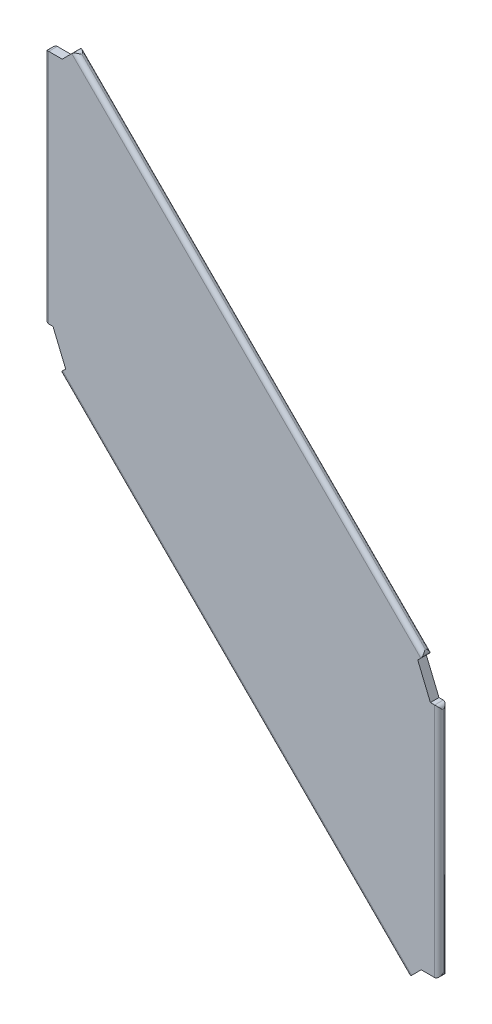
ISO-10303-21;
HEADER;
FILE_DESCRIPTION(('STEP AP214'),'2;1');
FILE_NAME('part.step','',(''),(''),'','','');
FILE_SCHEMA(('AUTOMOTIVE_DESIGN { 1 0 10303 214 1 1 1 1 }'));
ENDSEC;
DATA;
#1=APPLICATION_CONTEXT('core data for automotive mechanical design processes');
#2=APPLICATION_PROTOCOL_DEFINITION('international standard','automotive_design',2000,#1);
#3=PRODUCT_CONTEXT('',#1,'mechanical');
#4=PRODUCT('Part','Part','',(#3));
#5=PRODUCT_RELATED_PRODUCT_CATEGORY('part','',(#4));
#6=PRODUCT_DEFINITION_FORMATION('','',#4);
#7=PRODUCT_DEFINITION_CONTEXT('part definition',#1,'design');
#8=PRODUCT_DEFINITION('design','',#6,#7);
#9=PRODUCT_DEFINITION_SHAPE('','',#8);
#10=(LENGTH_UNIT() NAMED_UNIT(*) SI_UNIT(.MILLI.,.METRE.));
#11=(NAMED_UNIT(*) PLANE_ANGLE_UNIT() SI_UNIT($,.RADIAN.));
#12=(NAMED_UNIT(*) SI_UNIT($,.STERADIAN.) SOLID_ANGLE_UNIT());
#13=UNCERTAINTY_MEASURE_WITH_UNIT(LENGTH_MEASURE(1.E-05),#10,'distance_accuracy_value','');
#14=(GEOMETRIC_REPRESENTATION_CONTEXT(3) GLOBAL_UNCERTAINTY_ASSIGNED_CONTEXT((#13)) GLOBAL_UNIT_ASSIGNED_CONTEXT((#10,
#11,#12)) REPRESENTATION_CONTEXT('',''));
#15=CARTESIAN_POINT('',(0.,0.,0.));
#16=DIRECTION('',(0.,0.,1.));
#17=DIRECTION('',(1.,0.,0.));
#18=AXIS2_PLACEMENT_3D('',#15,#16,#17);
#19=CARTESIAN_POINT('',(0.,2.69238815542514,0.2));
#20=DIRECTION('',(0.,1.,0.));
#21=DIRECTION('',(-1.,0.,0.));
#22=AXIS2_PLACEMENT_3D('',#19,#20,#21);
#23=PLANE('',#22);
#24=DIRECTION('',(1.,0.,0.));
#25=VECTOR('',#24,1.);
#26=CARTESIAN_POINT('',(0.,2.69238815542514,0.2));
#27=LINE('',#26,#25);
#28=CARTESIAN_POINT('',(-9.09238815542507,2.69238815542516,0.2));
#29=VERTEX_POINT('',#28);
#30=CARTESIAN_POINT('',(-8.99238815542507,2.69238815542516,0.2));
#31=VERTEX_POINT('',#30);
#32=EDGE_CURVE('E215',#29,#31,#27,.T.);
#33=ORIENTED_EDGE('',*,*,#32,.F.);
#34=DIRECTION('',(0.,0.,-1.));
#35=VECTOR('',#34,1.);
#36=CARTESIAN_POINT('',(-9.09238815542507,2.69238815542516,0.2));
#37=LINE('',#36,#35);
#38=CARTESIAN_POINT('',(-9.09238815542507,2.69238815542516,0.));
#39=VERTEX_POINT('',#38);
#40=EDGE_CURVE('E156',#29,#39,#37,.T.);
#41=ORIENTED_EDGE('',*,*,#40,.T.);
#42=DIRECTION('',(1.,0.,0.));
#43=VECTOR('',#42,1.);
#44=CARTESIAN_POINT('',(0.,2.69238815542514,0.));
#45=LINE('',#44,#43);
#46=CARTESIAN_POINT('',(-8.99238815542507,2.69238815542516,0.));
#47=VERTEX_POINT('',#46);
#48=EDGE_CURVE('E143',#39,#47,#45,.T.);
#49=ORIENTED_EDGE('',*,*,#48,.T.);
#50=DIRECTION('',(0.,0.,-1.));
#51=VECTOR('',#50,1.);
#52=CARTESIAN_POINT('',(-8.99238815542507,2.69238815542516,0.2));
#53=LINE('',#52,#51);
#54=EDGE_CURVE('E193',#31,#47,#53,.T.);
#55=ORIENTED_EDGE('',*,*,#54,.F.);
#56=EDGE_LOOP('',(#33,#41,#49,#55));
#57=FACE_BOUND('',#56,.T.);
#58=ADVANCED_FACE('F36',(#57),#23,.F.);
#59=CARTESIAN_POINT('',(-6.72358043845012,-2.78499820531249,0.2));
#60=DIRECTION('',(0.923879532511287,0.382683432365091,0.));
#61=DIRECTION('',(-0.382683432365091,0.923879532511287,0.));
#62=AXIS2_PLACEMENT_3D('',#59,#60,#61);
#63=PLANE('',#62);
#64=DIRECTION('',(0.382683432365091,-0.923879532511286,0.));
#65=VECTOR('',#64,1.);
#66=CARTESIAN_POINT('',(-6.72358043845012,-2.78499820531249,0.));
#67=LINE('',#66,#65);
#68=CARTESIAN_POINT('',(-8.69741340859449,1.9802561210692,0.));
#69=VERTEX_POINT('',#68);
#70=EDGE_CURVE('E235',#47,#69,#67,.T.);
#71=ORIENTED_EDGE('',*,*,#70,.T.);
#72=DIRECTION('',(0.,0.,-1.));
#73=VECTOR('',#72,1.);
#74=CARTESIAN_POINT('',(-8.69741340859449,1.9802561210692,0.2));
#75=LINE('',#74,#73);
#76=CARTESIAN_POINT('',(-8.69741340859449,1.9802561210692,0.2));
#77=VERTEX_POINT('',#76);
#78=EDGE_CURVE('E196',#77,#69,#75,.T.);
#79=ORIENTED_EDGE('',*,*,#78,.F.);
#80=DIRECTION('',(0.382683432365091,-0.923879532511286,0.));
#81=VECTOR('',#80,1.);
#82=CARTESIAN_POINT('',(-6.72358043845012,-2.78499820531249,0.2));
#83=LINE('',#82,#81);
#84=EDGE_CURVE('E263',#31,#77,#83,.T.);
#85=ORIENTED_EDGE('',*,*,#84,.F.);
#86=ORIENTED_EDGE('',*,*,#54,.T.);
#87=EDGE_LOOP('',(#71,#79,#85,#86));
#88=FACE_BOUND('',#87,.T.);
#89=ADVANCED_FACE('F283',(#88),#63,.F.);
#90=CARTESIAN_POINT('',(-5.3388347648318,5.33883476483185,0.2));
#91=DIRECTION('',(0.707106781186544,-0.707106781186551,0.));
#92=DIRECTION('',(0.707106781186551,0.707106781186544,0.));
#93=AXIS2_PLACEMENT_3D('',#90,#91,#92);
#94=PLANE('',#93);
#95=DIRECTION('',(-0.707106781186551,-0.707106781186544,0.));
#96=VECTOR('',#95,1.);
#97=CARTESIAN_POINT('',(-5.3388347648318,5.33883476483185,0.));
#98=LINE('',#97,#96);
#99=CARTESIAN_POINT('',(-8.76812408671314,1.90954544295054,0.));
#100=VERTEX_POINT('',#99);
#101=EDGE_CURVE('E233',#69,#100,#98,.T.);
#102=ORIENTED_EDGE('',*,*,#101,.T.);
#103=DIRECTION('',(0.,0.,-1.));
#104=VECTOR('',#103,1.);
#105=CARTESIAN_POINT('',(-8.76812408671314,1.90954544295054,0.2));
#106=LINE('',#105,#104);
#107=CARTESIAN_POINT('',(-8.76812408671314,1.90954544295054,0.2));
#108=VERTEX_POINT('',#107);
#109=EDGE_CURVE('E164',#100,#108,#106,.F.);
#110=ORIENTED_EDGE('',*,*,#109,.T.);
#111=DIRECTION('',(-0.707106781186551,-0.707106781186544,0.));
#112=VECTOR('',#111,1.);
#113=CARTESIAN_POINT('',(-5.3388347648318,5.33883476483185,0.2));
#114=LINE('',#113,#112);
#115=EDGE_CURVE('E260',#77,#108,#114,.T.);
#116=ORIENTED_EDGE('',*,*,#115,.F.);
#117=ORIENTED_EDGE('',*,*,#78,.T.);
#118=EDGE_LOOP('',(#102,#110,#116,#117));
#119=FACE_BOUND('',#118,.T.);
#120=ADVANCED_FACE('F295',(#119),#94,.F.);
#121=CARTESIAN_POINT('',(2.79289321881346,-2.79289321881348,0.2));
#122=DIRECTION('',(0.707106781186545,-0.707106781186551,0.));
#123=DIRECTION('',(0.707106781186551,0.707106781186545,0.));
#124=AXIS2_PLACEMENT_3D('',#121,#122,#123);
#125=PLANE('',#124);
#126=DIRECTION('',(-0.707106781186551,-0.707106781186544,0.));
#127=VECTOR('',#126,1.);
#128=CARTESIAN_POINT('',(2.79289321881346,-2.79289321881348,0.2));
#129=LINE('',#128,#127);
#130=CARTESIAN_POINT('',(-0.414213562373092,-6.,0.2));
#131=VERTEX_POINT('',#130);
#132=CARTESIAN_POINT('',(-0.636396103067887,-6.22218254069479,0.2));
#133=VERTEX_POINT('',#132);
#134=EDGE_CURVE('E257',#131,#133,#129,.T.);
#135=ORIENTED_EDGE('',*,*,#134,.T.);
#136=DIRECTION('',(0.,0.,-1.));
#137=VECTOR('',#136,1.);
#138=CARTESIAN_POINT('',(-0.636396103067888,-6.22218254069479,0.2));
#139=LINE('',#138,#137);
#140=CARTESIAN_POINT('',(-0.636396103067887,-6.22218254069479,0.));
#141=VERTEX_POINT('',#140);
#142=EDGE_CURVE('E162',#133,#141,#139,.T.);
#143=ORIENTED_EDGE('',*,*,#142,.T.);
#144=DIRECTION('',(-0.707106781186551,-0.707106781186544,0.));
#145=VECTOR('',#144,1.);
#146=CARTESIAN_POINT('',(2.79289321881346,-2.79289321881348,0.));
#147=LINE('',#146,#145);
#148=CARTESIAN_POINT('',(-0.414213562373092,-6.,0.));
#149=VERTEX_POINT('',#148);
#150=EDGE_CURVE('E231',#149,#141,#147,.T.);
#151=ORIENTED_EDGE('',*,*,#150,.F.);
#152=DIRECTION('',(0.,0.,-1.));
#153=VECTOR('',#152,1.);
#154=CARTESIAN_POINT('',(-0.414213562373092,-6.,0.2));
#155=LINE('',#154,#153);
#156=EDGE_CURVE('E199',#131,#149,#155,.T.);
#157=ORIENTED_EDGE('',*,*,#156,.F.);
#158=EDGE_LOOP('',(#135,#143,#151,#157));
#159=FACE_BOUND('',#158,.T.);
#160=ADVANCED_FACE('F561',(#159),#125,.T.);
#161=CARTESIAN_POINT('',(0.,-6.,0.2));
#162=DIRECTION('',(0.,-1.,0.));
#163=DIRECTION('',(0.,0.,-1.));
#164=AXIS2_PLACEMENT_3D('',#161,#162,#163);
#165=PLANE('',#164);
#166=DIRECTION('',(-1.,0.,0.));
#167=VECTOR('',#166,1.);
#168=CARTESIAN_POINT('',(0.,-6.,0.));
#169=LINE('',#168,#167);
#170=CARTESIAN_POINT('',(-0.0999999999999993,-6.,0.));
#171=VERTEX_POINT('',#170);
#172=EDGE_CURVE('E228',#171,#149,#169,.T.);
#173=ORIENTED_EDGE('',*,*,#172,.F.);
#174=DIRECTION('',(0.,0.,-1.));
#175=VECTOR('',#174,1.);
#176=CARTESIAN_POINT('',(-0.0999999999999993,-6.,0.2));
#177=LINE('',#176,#175);
#178=CARTESIAN_POINT('',(-0.0999999999999993,-6.,0.2));
#179=VERTEX_POINT('',#178);
#180=EDGE_CURVE('E190',#171,#179,#177,.F.);
#181=ORIENTED_EDGE('',*,*,#180,.T.);
#182=DIRECTION('',(-1.,0.,0.));
#183=VECTOR('',#182,1.);
#184=CARTESIAN_POINT('',(0.,-6.,0.2));
#185=LINE('',#184,#183);
#186=EDGE_CURVE('E254',#179,#131,#185,.T.);
#187=ORIENTED_EDGE('',*,*,#186,.T.);
#188=ORIENTED_EDGE('',*,*,#156,.T.);
#189=EDGE_LOOP('',(#173,#181,#187,#188));
#190=FACE_BOUND('',#189,.T.);
#191=ADVANCED_FACE('F552',(#190),#165,.T.);
#192=CARTESIAN_POINT('',(0.,-0.5,0.2));
#193=DIRECTION('',(0.,1.,0.));
#194=DIRECTION('',(0.,0.,1.));
#195=AXIS2_PLACEMENT_3D('',#192,#193,#194);
#196=PLANE('',#195);
#197=DIRECTION('',(1.,0.,0.));
#198=VECTOR('',#197,1.);
#199=CARTESIAN_POINT('',(0.,-0.5,0.2));
#200=LINE('',#199,#198);
#201=CARTESIAN_POINT('',(-0.2,-0.5,0.2));
#202=VERTEX_POINT('',#201);
#203=CARTESIAN_POINT('',(-0.0999999999999999,-0.5,0.2));
#204=VERTEX_POINT('',#203);
#205=EDGE_CURVE('E251',#202,#204,#200,.T.);
#206=ORIENTED_EDGE('',*,*,#205,.T.);
#207=DIRECTION('',(0.,0.,-1.));
#208=VECTOR('',#207,1.);
#209=CARTESIAN_POINT('',(-0.0999999999999999,-0.5,0.2));
#210=LINE('',#209,#208);
#211=CARTESIAN_POINT('',(-0.1,-0.5,0.));
#212=VERTEX_POINT('',#211);
#213=EDGE_CURVE('E175',#204,#212,#210,.T.);
#214=ORIENTED_EDGE('',*,*,#213,.T.);
#215=DIRECTION('',(1.,0.,0.));
#216=VECTOR('',#215,1.);
#217=CARTESIAN_POINT('',(0.,-0.5,0.));
#218=LINE('',#217,#216);
#219=CARTESIAN_POINT('',(-0.2,-0.5,0.));
#220=VERTEX_POINT('',#219);
#221=EDGE_CURVE('E225',#220,#212,#218,.T.);
#222=ORIENTED_EDGE('',*,*,#221,.F.);
#223=DIRECTION('',(0.,0.,-1.));
#224=VECTOR('',#223,1.);
#225=CARTESIAN_POINT('',(-0.2,-0.5,0.2));
#226=LINE('',#225,#224);
#227=EDGE_CURVE('E202',#202,#220,#226,.T.);
#228=ORIENTED_EDGE('',*,*,#227,.F.);
#229=EDGE_LOOP('',(#206,#214,#222,#228));
#230=FACE_BOUND('',#229,.T.);
#231=ADVANCED_FACE('F543',(#230),#196,.T.);
#232=CARTESIAN_POINT('',(-0.347487373415291,-0.143933982822017,0.2));
#233=DIRECTION('',(0.923879532511288,0.382683432365088,0.));
#234=DIRECTION('',(-0.382683432365088,0.923879532511288,0.));
#235=AXIS2_PLACEMENT_3D('',#232,#233,#234);
#236=PLANE('',#235);
#237=DIRECTION('',(0.382683432365088,-0.923879532511288,0.));
#238=VECTOR('',#237,1.);
#239=CARTESIAN_POINT('',(-0.347487373415291,-0.143933982822017,0.));
#240=LINE('',#239,#238);
#241=CARTESIAN_POINT('',(-0.494974746830582,0.212132034355967,0.));
#242=VERTEX_POINT('',#241);
#243=EDGE_CURVE('E222',#242,#220,#240,.T.);
#244=ORIENTED_EDGE('',*,*,#243,.F.);
#245=DIRECTION('',(0.,0.,-1.));
#246=VECTOR('',#245,1.);
#247=CARTESIAN_POINT('',(-0.494974746830582,0.212132034355967,0.2));
#248=LINE('',#247,#246);
#249=CARTESIAN_POINT('',(-0.494974746830582,0.212132034355967,0.2));
#250=VERTEX_POINT('',#249);
#251=EDGE_CURVE('E205',#250,#242,#248,.T.);
#252=ORIENTED_EDGE('',*,*,#251,.F.);
#253=DIRECTION('',(0.382683432365088,-0.923879532511288,0.));
#254=VECTOR('',#253,1.);
#255=CARTESIAN_POINT('',(-0.347487373415291,-0.143933982822017,0.2));
#256=LINE('',#255,#254);
#257=EDGE_CURVE('E248',#250,#202,#256,.T.);
#258=ORIENTED_EDGE('',*,*,#257,.T.);
#259=ORIENTED_EDGE('',*,*,#227,.T.);
#260=EDGE_LOOP('',(#244,#252,#258,#259));
#261=FACE_BOUND('',#260,.T.);
#262=ADVANCED_FACE('F534',(#261),#236,.T.);
#263=CARTESIAN_POINT('',(-0.353553390593272,0.353553390593276,0.2));
#264=DIRECTION('',(0.707106781186544,-0.707106781186551,0.));
#265=DIRECTION('',(0.707106781186551,0.707106781186544,0.));
#266=AXIS2_PLACEMENT_3D('',#263,#264,#265);
#267=PLANE('',#266);
#268=DIRECTION('',(-0.707106781186551,-0.707106781186544,0.));
#269=VECTOR('',#268,1.);
#270=CARTESIAN_POINT('',(-0.353553390593272,0.353553390593276,0.));
#271=LINE('',#270,#269);
#272=CARTESIAN_POINT('',(-0.424264068711927,0.282842712474621,0.));
#273=VERTEX_POINT('',#272);
#274=EDGE_CURVE('E219',#273,#242,#271,.T.);
#275=ORIENTED_EDGE('',*,*,#274,.F.);
#276=DIRECTION('',(0.,0.,-1.));
#277=VECTOR('',#276,1.);
#278=CARTESIAN_POINT('',(-0.424264068711927,0.282842712474621,0.2));
#279=LINE('',#278,#277);
#280=CARTESIAN_POINT('',(-0.424264068711927,0.282842712474621,0.2));
#281=VERTEX_POINT('',#280);
#282=EDGE_CURVE('E46',#273,#281,#279,.F.);
#283=ORIENTED_EDGE('',*,*,#282,.T.);
#284=DIRECTION('',(-0.707106781186551,-0.707106781186544,0.));
#285=VECTOR('',#284,1.);
#286=CARTESIAN_POINT('',(-0.353553390593272,0.353553390593276,0.2));
#287=LINE('',#286,#285);
#288=EDGE_CURVE('E245',#281,#250,#287,.T.);
#289=ORIENTED_EDGE('',*,*,#288,.T.);
#290=ORIENTED_EDGE('',*,*,#251,.T.);
#291=EDGE_LOOP('',(#275,#283,#289,#290));
#292=FACE_BOUND('',#291,.T.);
#293=ADVANCED_FACE('F329',(#292),#267,.T.);
#294=CARTESIAN_POINT('',(-8.48528137423855,8.4852813742386,0.2));
#295=DIRECTION('',(0.707106781186545,-0.70710678118655,0.));
#296=DIRECTION('',(0.70710678118655,0.707106781186545,0.));
#297=AXIS2_PLACEMENT_3D('',#294,#295,#296);
#298=PLANE('',#297);
#299=DIRECTION('',(-0.70710678118655,-0.707106781186545,0.));
#300=VECTOR('',#299,1.);
#301=CARTESIAN_POINT('',(-8.48528137423855,8.4852813742386,0.2));
#302=LINE('',#301,#300);
#303=CARTESIAN_POINT('',(-8.55599205235719,8.41457069611996,0.2));
#304=VERTEX_POINT('',#303);
#305=CARTESIAN_POINT('',(-8.77817459305198,8.19238815542517,0.2));
#306=VERTEX_POINT('',#305);
#307=EDGE_CURVE('E242',#304,#306,#302,.T.);
#308=ORIENTED_EDGE('',*,*,#307,.F.);
#309=DIRECTION('',(0.,0.,-1.));
#310=VECTOR('',#309,1.);
#311=CARTESIAN_POINT('',(-8.55599205235719,8.41457069611996,0.2));
#312=LINE('',#311,#310);
#313=CARTESIAN_POINT('',(-8.55599205235719,8.41457069611996,0.));
#314=VERTEX_POINT('',#313);
#315=EDGE_CURVE('E11',#304,#314,#312,.T.);
#316=ORIENTED_EDGE('',*,*,#315,.T.);
#317=DIRECTION('',(-0.70710678118655,-0.707106781186545,0.));
#318=VECTOR('',#317,1.);
#319=CARTESIAN_POINT('',(-8.48528137423855,8.4852813742386,0.));
#320=LINE('',#319,#318);
#321=CARTESIAN_POINT('',(-8.77817459305198,8.19238815542517,0.));
#322=VERTEX_POINT('',#321);
#323=EDGE_CURVE('E216',#314,#322,#320,.T.);
#324=ORIENTED_EDGE('',*,*,#323,.T.);
#325=DIRECTION('',(0.,0.,-1.));
#326=VECTOR('',#325,1.);
#327=CARTESIAN_POINT('',(-8.77817459305198,8.19238815542517,0.2));
#328=LINE('',#327,#326);
#329=EDGE_CURVE('E208',#306,#322,#328,.T.);
#330=ORIENTED_EDGE('',*,*,#329,.F.);
#331=EDGE_LOOP('',(#308,#316,#324,#330));
#332=FACE_BOUND('',#331,.T.);
#333=ADVANCED_FACE('F340',(#332),#298,.F.);
#334=CARTESIAN_POINT('',(0.,8.19238815542517,0.2));
#335=DIRECTION('',(0.,-1.,0.));
#336=DIRECTION('',(0.,0.,-1.));
#337=AXIS2_PLACEMENT_3D('',#334,#335,#336);
#338=PLANE('',#337);
#339=DIRECTION('',(-1.,0.,0.));
#340=VECTOR('',#339,1.);
#341=CARTESIAN_POINT('',(0.,8.19238815542517,0.));
#342=LINE('',#341,#340);
#343=CARTESIAN_POINT('',(-9.09238815542507,8.19238815542517,0.));
#344=VERTEX_POINT('',#343);
#345=EDGE_CURVE('E212',#322,#344,#342,.T.);
#346=ORIENTED_EDGE('',*,*,#345,.T.);
#347=DIRECTION('',(0.,0.,-1.));
#348=VECTOR('',#347,1.);
#349=CARTESIAN_POINT('',(-9.09238815542507,8.19238815542517,0.2));
#350=LINE('',#349,#348);
#351=CARTESIAN_POINT('',(-9.09238815542507,8.19238815542517,0.2));
#352=VERTEX_POINT('',#351);
#353=EDGE_CURVE('E159',#344,#352,#350,.F.);
#354=ORIENTED_EDGE('',*,*,#353,.T.);
#355=DIRECTION('',(-1.,0.,0.));
#356=VECTOR('',#355,1.);
#357=CARTESIAN_POINT('',(0.,8.19238815542517,0.2));
#358=LINE('',#357,#356);
#359=EDGE_CURVE('E211',#306,#352,#358,.T.);
#360=ORIENTED_EDGE('',*,*,#359,.F.);
#361=ORIENTED_EDGE('',*,*,#329,.T.);
#362=EDGE_LOOP('',(#346,#354,#360,#361));
#363=FACE_BOUND('',#362,.T.);
#364=ADVANCED_FACE('F346',(#363),#338,.F.);
#365=CARTESIAN_POINT('',(0.,0.,0.2));
#366=DIRECTION('',(0.,0.,1.));
#367=DIRECTION('',(1.,0.,0.));
#368=AXIS2_PLACEMENT_3D('',#365,#366,#367);
#369=PLANE('',#368);
#370=ORIENTED_EDGE('',*,*,#186,.F.);
#371=DIRECTION('',(0.,-1.,0.));
#372=VECTOR('',#371,1.);
#373=CARTESIAN_POINT('',(-0.1,0.,0.2));
#374=LINE('',#373,#372);
#375=EDGE_CURVE('E178',#179,#204,#374,.F.);
#376=ORIENTED_EDGE('',*,*,#375,.T.);
#377=ORIENTED_EDGE('',*,*,#205,.F.);
#378=ORIENTED_EDGE('',*,*,#257,.F.);
#379=ORIENTED_EDGE('',*,*,#288,.F.);
#380=DIRECTION('',(-0.707106781186544,0.707106781186551,0.));
#381=VECTOR('',#380,1.);
#382=CARTESIAN_POINT('',(-8.55599205235719,8.41457069611996,0.2));
#383=LINE('',#382,#381);
#384=EDGE_CURVE('E187',#281,#304,#383,.T.);
#385=ORIENTED_EDGE('',*,*,#384,.T.);
#386=ORIENTED_EDGE('',*,*,#307,.T.);
#387=ORIENTED_EDGE('',*,*,#359,.T.);
#388=DIRECTION('',(0.,-1.,0.));
#389=VECTOR('',#388,1.);
#390=CARTESIAN_POINT('',(-9.09238815542507,2.69238815542516,0.2));
#391=LINE('',#390,#389);
#392=EDGE_CURVE('E184',#352,#29,#391,.T.);
#393=ORIENTED_EDGE('',*,*,#392,.T.);
#394=ORIENTED_EDGE('',*,*,#32,.T.);
#395=ORIENTED_EDGE('',*,*,#84,.T.);
#396=ORIENTED_EDGE('',*,*,#115,.T.);
#397=DIRECTION('',(-0.707106781186544,0.707106781186551,0.));
#398=VECTOR('',#397,1.);
#399=CARTESIAN_POINT('',(-3.42928932188134,-3.42928932188131,0.2));
#400=LINE('',#399,#398);
#401=EDGE_CURVE('E181',#108,#133,#400,.F.);
#402=ORIENTED_EDGE('',*,*,#401,.T.);
#403=ORIENTED_EDGE('',*,*,#134,.F.);
#404=EDGE_LOOP('',(#370,#376,#377,#378,#379,#385,#386,#387,#393,#394,#395,#396,#402,#403));
#405=FACE_BOUND('',#404,.T.);
#406=ADVANCED_FACE('F272',(#405),#369,.T.);
#407=CARTESIAN_POINT('',(0.,0.,0.));
#408=DIRECTION('',(0.,0.,1.));
#409=DIRECTION('',(1.,0.,0.));
#410=AXIS2_PLACEMENT_3D('',#407,#408,#409);
#411=PLANE('',#410);
#412=ORIENTED_EDGE('',*,*,#221,.T.);
#413=DIRECTION('',(0.,-1.,0.));
#414=VECTOR('',#413,1.);
#415=CARTESIAN_POINT('',(-0.0999999999999993,-6.,0.));
#416=LINE('',#415,#414);
#417=EDGE_CURVE('E167',#212,#171,#416,.T.);
#418=ORIENTED_EDGE('',*,*,#417,.T.);
#419=ORIENTED_EDGE('',*,*,#172,.T.);
#420=ORIENTED_EDGE('',*,*,#150,.T.);
#421=DIRECTION('',(-0.707106781186544,0.707106781186551,0.));
#422=VECTOR('',#421,1.);
#423=CARTESIAN_POINT('',(-8.76812408671314,1.90954544295054,0.));
#424=LINE('',#423,#422);
#425=EDGE_CURVE('E55',#141,#100,#424,.T.);
#426=ORIENTED_EDGE('',*,*,#425,.T.);
#427=ORIENTED_EDGE('',*,*,#101,.F.);
#428=ORIENTED_EDGE('',*,*,#70,.F.);
#429=ORIENTED_EDGE('',*,*,#48,.F.);
#430=DIRECTION('',(0.,-1.,0.));
#431=VECTOR('',#430,1.);
#432=CARTESIAN_POINT('',(-9.09238815542507,0.,0.));
#433=LINE('',#432,#431);
#434=EDGE_CURVE('E171',#39,#344,#433,.F.);
#435=ORIENTED_EDGE('',*,*,#434,.T.);
#436=ORIENTED_EDGE('',*,*,#345,.F.);
#437=ORIENTED_EDGE('',*,*,#323,.F.);
#438=DIRECTION('',(-0.707106781186544,0.707106781186551,0.));
#439=VECTOR('',#438,1.);
#440=CARTESIAN_POINT('',(-0.0707106781186551,-0.0707106781186544,0.));
#441=LINE('',#440,#439);
#442=EDGE_CURVE('E106',#314,#273,#441,.F.);
#443=ORIENTED_EDGE('',*,*,#442,.T.);
#444=ORIENTED_EDGE('',*,*,#274,.T.);
#445=ORIENTED_EDGE('',*,*,#243,.T.);
#446=EDGE_LOOP('',(#412,#418,#419,#420,#426,#427,#428,#429,#435,#436,#437,#443,#444,#445));
#447=FACE_BOUND('',#446,.T.);
#448=ADVANCED_FACE('F291',(#447),#411,.F.);
#449=CARTESIAN_POINT('',(-0.0999999999999999,-0.6,0.2));
#450=DIRECTION('',(0.,0.,-1.));
#451=DIRECTION('',(-1.,0.,0.));
#452=AXIS2_PLACEMENT_3D('',#449,#450,#451);
#453=CYLINDRICAL_SURFACE('',#452,0.1);
#454=CARTESIAN_POINT('',(-0.0999999999999999,-0.6,0.1));
#455=DIRECTION('',(0.,0.707106781186547,0.707106781186547));
#456=DIRECTION('',(0.,0.707106781186547,-0.707106781186547));
#457=AXIS2_PLACEMENT_3D('',#454,#455,#456);
#458=ELLIPSE('',#457,0.14142135623731,0.1);
#459=CARTESIAN_POINT('',(0.,-0.6,0.1));
#460=VERTEX_POINT('',#459);
#461=EDGE_CURVE('E146',#212,#460,#458,.F.);
#462=ORIENTED_EDGE('',*,*,#461,.F.);
#463=ORIENTED_EDGE('',*,*,#213,.F.);
#464=CARTESIAN_POINT('',(-0.0999999999999999,-0.6,0.1));
#465=DIRECTION('',(0.,0.707106781186547,-0.707106781186547));
#466=DIRECTION('',(0.,-0.707106781186547,-0.707106781186547));
#467=AXIS2_PLACEMENT_3D('',#464,#465,#466);
#468=ELLIPSE('',#467,0.14142135623731,0.1);
#469=EDGE_CURVE('E140',#460,#204,#468,.F.);
#470=ORIENTED_EDGE('',*,*,#469,.F.);
#471=EDGE_LOOP('',(#462,#463,#470));
#472=FACE_BOUND('',#471,.T.);
#473=ADVANCED_FACE('F391',(#472),#453,.T.);
#474=CARTESIAN_POINT('',(-0.1,0.,0.1));
#475=DIRECTION('',(0.,-1.,0.));
#476=DIRECTION('',(1.,0.,0.));
#477=AXIS2_PLACEMENT_3D('',#474,#475,#476);
#478=CYLINDRICAL_SURFACE('',#477,0.1);
#479=DIRECTION('',(0.,-1.,0.));
#480=VECTOR('',#479,1.);
#481=CARTESIAN_POINT('',(0.,0.,0.1));
#482=LINE('',#481,#480);
#483=CARTESIAN_POINT('',(0.,-5.9,0.1));
#484=VERTEX_POINT('',#483);
#485=EDGE_CURVE('E144',#460,#484,#482,.T.);
#486=ORIENTED_EDGE('',*,*,#485,.F.);
#487=ORIENTED_EDGE('',*,*,#469,.T.);
#488=ORIENTED_EDGE('',*,*,#375,.F.);
#489=CARTESIAN_POINT('',(-0.0999999999999993,-5.9,0.1));
#490=DIRECTION('',(0.,-0.707106781186547,-0.707106781186547));
#491=DIRECTION('',(0.,-0.707106781186547,0.707106781186547));
#492=AXIS2_PLACEMENT_3D('',#489,#490,#491);
#493=ELLIPSE('',#492,0.14142135623731,0.1);
#494=EDGE_CURVE('E149',#484,#179,#493,.T.);
#495=ORIENTED_EDGE('',*,*,#494,.F.);
#496=EDGE_LOOP('',(#486,#487,#488,#495));
#497=FACE_BOUND('',#496,.T.);
#498=ADVANCED_FACE('F387',(#497),#478,.T.);
#499=CARTESIAN_POINT('',(-0.1,0.,0.1));
#500=DIRECTION('',(0.,1.,0.));
#501=DIRECTION('',(-1.,0.,0.));
#502=AXIS2_PLACEMENT_3D('',#499,#500,#501);
#503=CYLINDRICAL_SURFACE('',#502,0.1);
#504=ORIENTED_EDGE('',*,*,#461,.T.);
#505=ORIENTED_EDGE('',*,*,#485,.T.);
#506=CARTESIAN_POINT('',(-0.0999999999999993,-5.9,0.1));
#507=DIRECTION('',(0.,0.707106781186547,-0.707106781186547));
#508=DIRECTION('',(0.,0.707106781186547,0.707106781186547));
#509=AXIS2_PLACEMENT_3D('',#506,#507,#508);
#510=ELLIPSE('',#509,0.14142135623731,0.1);
#511=EDGE_CURVE('E129',#171,#484,#510,.F.);
#512=ORIENTED_EDGE('',*,*,#511,.F.);
#513=ORIENTED_EDGE('',*,*,#417,.F.);
#514=EDGE_LOOP('',(#504,#505,#512,#513));
#515=FACE_BOUND('',#514,.T.);
#516=ADVANCED_FACE('F383',(#515),#503,.T.);
#517=CARTESIAN_POINT('',(-0.0999999999999993,-5.9,0.2));
#518=DIRECTION('',(0.,0.,-1.));
#519=DIRECTION('',(-1.,0.,0.));
#520=AXIS2_PLACEMENT_3D('',#517,#518,#519);
#521=CYLINDRICAL_SURFACE('',#520,0.1);
#522=ORIENTED_EDGE('',*,*,#494,.T.);
#523=ORIENTED_EDGE('',*,*,#180,.F.);
#524=ORIENTED_EDGE('',*,*,#511,.T.);
#525=EDGE_LOOP('',(#522,#523,#524));
#526=FACE_BOUND('',#525,.T.);
#527=ADVANCED_FACE('F379',(#526),#521,.T.);
#528=CARTESIAN_POINT('',(-0.707106781186542,-6.15147186257614,0.2));
#529=DIRECTION('',(0.,0.,-1.));
#530=DIRECTION('',(-1.,0.,0.));
#531=AXIS2_PLACEMENT_3D('',#528,#529,#530);
#532=CYLINDRICAL_SURFACE('',#531,0.1);
#533=CARTESIAN_POINT('',(-0.707106781186542,-6.15147186257614,0.1));
#534=DIRECTION('',(0.499999999999997,-0.500000000000003,0.707106781186547));
#535=DIRECTION('',(0.499999999999997,-0.500000000000003,-0.707106781186547));
#536=AXIS2_PLACEMENT_3D('',#533,#534,#535);
#537=ELLIPSE('',#536,0.14142135623731,0.1);
#538=CARTESIAN_POINT('',(-0.777817459305198,-6.22218254069479,0.1));
#539=VERTEX_POINT('',#538);
#540=EDGE_CURVE('E132',#141,#539,#537,.F.);
#541=ORIENTED_EDGE('',*,*,#540,.F.);
#542=ORIENTED_EDGE('',*,*,#142,.F.);
#543=CARTESIAN_POINT('',(-0.707106781186543,-6.15147186257614,0.1));
#544=DIRECTION('',(0.499999999999997,-0.500000000000003,-0.707106781186547));
#545=DIRECTION('',(-0.499999999999997,0.500000000000003,-0.707106781186547));
#546=AXIS2_PLACEMENT_3D('',#543,#544,#545);
#547=ELLIPSE('',#546,0.14142135623731,0.1);
#548=EDGE_CURVE('E126',#539,#133,#547,.F.);
#549=ORIENTED_EDGE('',*,*,#548,.F.);
#550=EDGE_LOOP('',(#541,#542,#549));
#551=FACE_BOUND('',#550,.T.);
#552=ADVANCED_FACE('F382',(#551),#532,.T.);
#553=CARTESIAN_POINT('',(-3.42928932188134,-3.42928932188131,0.1));
#554=DIRECTION('',(-0.707106781186544,0.707106781186551,0.));
#555=DIRECTION('',(-0.707106781186551,-0.707106781186544,0.));
#556=AXIS2_PLACEMENT_3D('',#553,#554,#555);
#557=CYLINDRICAL_SURFACE('',#556,0.1);
#558=DIRECTION('',(-0.707106781186544,0.707106781186551,0.));
#559=VECTOR('',#558,1.);
#560=CARTESIAN_POINT('',(-3.5,-3.49999999999996,0.1));
#561=LINE('',#560,#559);
#562=CARTESIAN_POINT('',(-8.76812408671314,1.76812408671323,0.1));
#563=VERTEX_POINT('',#562);
#564=EDGE_CURVE('E130',#539,#563,#561,.T.);
#565=ORIENTED_EDGE('',*,*,#564,.F.);
#566=ORIENTED_EDGE('',*,*,#548,.T.);
#567=ORIENTED_EDGE('',*,*,#401,.F.);
#568=CARTESIAN_POINT('',(-8.69741340859449,1.83883476483189,0.1));
#569=DIRECTION('',(-0.499999999999997,0.500000000000003,-0.707106781186547));
#570=DIRECTION('',(-0.499999999999997,0.500000000000003,0.707106781186547));
#571=AXIS2_PLACEMENT_3D('',#568,#569,#570);
#572=ELLIPSE('',#571,0.14142135623731,0.1);
#573=EDGE_CURVE('E135',#563,#108,#572,.T.);
#574=ORIENTED_EDGE('',*,*,#573,.F.);
#575=EDGE_LOOP('',(#565,#566,#567,#574));
#576=FACE_BOUND('',#575,.T.);
#577=ADVANCED_FACE('F398',(#576),#557,.T.);
#578=CARTESIAN_POINT('',(-3.42928932188134,-3.42928932188131,0.1));
#579=DIRECTION('',(0.707106781186544,-0.707106781186551,0.));
#580=DIRECTION('',(0.707106781186551,0.707106781186544,0.));
#581=AXIS2_PLACEMENT_3D('',#578,#579,#580);
#582=CYLINDRICAL_SURFACE('',#581,0.1);
#583=ORIENTED_EDGE('',*,*,#540,.T.);
#584=ORIENTED_EDGE('',*,*,#564,.T.);
#585=CARTESIAN_POINT('',(-8.69741340859449,1.83883476483189,0.1));
#586=DIRECTION('',(0.499999999999997,-0.500000000000003,-0.707106781186547));
#587=DIRECTION('',(0.499999999999997,-0.500000000000003,0.707106781186547));
#588=AXIS2_PLACEMENT_3D('',#585,#586,#587);
#589=ELLIPSE('',#588,0.14142135623731,0.1);
#590=EDGE_CURVE('E115',#100,#563,#589,.F.);
#591=ORIENTED_EDGE('',*,*,#590,.F.);
#592=ORIENTED_EDGE('',*,*,#425,.F.);
#593=EDGE_LOOP('',(#583,#584,#591,#592));
#594=FACE_BOUND('',#593,.T.);
#595=ADVANCED_FACE('F368',(#594),#582,.T.);
#596=CARTESIAN_POINT('',(-8.69741340859449,1.83883476483189,0.2));
#597=DIRECTION('',(0.,0.,1.));
#598=DIRECTION('',(1.,0.,0.));
#599=AXIS2_PLACEMENT_3D('',#596,#597,#598);
#600=CYLINDRICAL_SURFACE('',#599,0.1);
#601=ORIENTED_EDGE('',*,*,#573,.T.);
#602=ORIENTED_EDGE('',*,*,#109,.F.);
#603=ORIENTED_EDGE('',*,*,#590,.T.);
#604=EDGE_LOOP('',(#601,#602,#603));
#605=FACE_BOUND('',#604,.T.);
#606=ADVANCED_FACE('F361',(#605),#600,.T.);
#607=CARTESIAN_POINT('',(-9.09238815542507,2.79238815542516,0.2));
#608=DIRECTION('',(0.,0.,-1.));
#609=DIRECTION('',(-1.,0.,0.));
#610=AXIS2_PLACEMENT_3D('',#607,#608,#609);
#611=CYLINDRICAL_SURFACE('',#610,0.1);
#612=CARTESIAN_POINT('',(-9.09238815542507,2.79238815542516,0.1));
#613=DIRECTION('',(0.,-0.707106781186547,0.707106781186547));
#614=DIRECTION('',(0.,-0.707106781186547,-0.707106781186547));
#615=AXIS2_PLACEMENT_3D('',#612,#613,#614);
#616=ELLIPSE('',#615,0.14142135623731,0.1);
#617=CARTESIAN_POINT('',(-9.19238815542507,2.79238815542516,0.1));
#618=VERTEX_POINT('',#617);
#619=EDGE_CURVE('E118',#39,#618,#616,.F.);
#620=ORIENTED_EDGE('',*,*,#619,.F.);
#621=ORIENTED_EDGE('',*,*,#40,.F.);
#622=CARTESIAN_POINT('',(-9.09238815542507,2.79238815542516,0.1));
#623=DIRECTION('',(0.,-0.707106781186547,-0.707106781186547));
#624=DIRECTION('',(0.,0.707106781186547,-0.707106781186547));
#625=AXIS2_PLACEMENT_3D('',#622,#623,#624);
#626=ELLIPSE('',#625,0.14142135623731,0.1);
#627=EDGE_CURVE('E112',#618,#29,#626,.F.);
#628=ORIENTED_EDGE('',*,*,#627,.F.);
#629=EDGE_LOOP('',(#620,#621,#628));
#630=FACE_BOUND('',#629,.T.);
#631=ADVANCED_FACE('F359',(#630),#611,.T.);
#632=CARTESIAN_POINT('',(-9.09238815542507,0.,0.1));
#633=DIRECTION('',(0.,1.,0.));
#634=DIRECTION('',(-1.,0.,0.));
#635=AXIS2_PLACEMENT_3D('',#632,#633,#634);
#636=CYLINDRICAL_SURFACE('',#635,0.1);
#637=DIRECTION('',(0.,-1.,0.));
#638=VECTOR('',#637,1.);
#639=CARTESIAN_POINT('',(-9.19238815542507,8.19238815542517,0.1));
#640=LINE('',#639,#638);
#641=CARTESIAN_POINT('',(-9.19238815542507,8.09238815542517,0.1));
#642=VERTEX_POINT('',#641);
#643=EDGE_CURVE('E116',#618,#642,#640,.F.);
#644=ORIENTED_EDGE('',*,*,#643,.F.);
#645=ORIENTED_EDGE('',*,*,#627,.T.);
#646=ORIENTED_EDGE('',*,*,#392,.F.);
#647=CARTESIAN_POINT('',(-9.09238815542507,8.09238815542517,0.1));
#648=DIRECTION('',(0.,0.707106781186547,-0.707106781186547));
#649=DIRECTION('',(0.,0.707106781186547,0.707106781186547));
#650=AXIS2_PLACEMENT_3D('',#647,#648,#649);
#651=ELLIPSE('',#650,0.14142135623731,0.1);
#652=EDGE_CURVE('E121',#642,#352,#651,.T.);
#653=ORIENTED_EDGE('',*,*,#652,.F.);
#654=EDGE_LOOP('',(#644,#645,#646,#653));
#655=FACE_BOUND('',#654,.T.);
#656=ADVANCED_FACE('F357',(#655),#636,.T.);
#657=CARTESIAN_POINT('',(-9.09238815542507,0.,0.1));
#658=DIRECTION('',(0.,-1.,0.));
#659=DIRECTION('',(1.,0.,0.));
#660=AXIS2_PLACEMENT_3D('',#657,#658,#659);
#661=CYLINDRICAL_SURFACE('',#660,0.1);
#662=ORIENTED_EDGE('',*,*,#619,.T.);
#663=ORIENTED_EDGE('',*,*,#643,.T.);
#664=CARTESIAN_POINT('',(-9.09238815542507,8.09238815542517,0.1));
#665=DIRECTION('',(0.,-0.707106781186547,-0.707106781186547));
#666=DIRECTION('',(0.,-0.707106781186547,0.707106781186547));
#667=AXIS2_PLACEMENT_3D('',#664,#665,#666);
#668=ELLIPSE('',#667,0.14142135623731,0.1);
#669=EDGE_CURVE('E99',#344,#642,#668,.F.);
#670=ORIENTED_EDGE('',*,*,#669,.F.);
#671=ORIENTED_EDGE('',*,*,#434,.F.);
#672=EDGE_LOOP('',(#662,#663,#670,#671));
#673=FACE_BOUND('',#672,.T.);
#674=ADVANCED_FACE('F354',(#673),#661,.T.);
#675=CARTESIAN_POINT('',(-9.09238815542507,8.09238815542517,0.2));
#676=DIRECTION('',(0.,0.,-1.));
#677=DIRECTION('',(-1.,0.,0.));
#678=AXIS2_PLACEMENT_3D('',#675,#676,#677);
#679=CYLINDRICAL_SURFACE('',#678,0.1);
#680=ORIENTED_EDGE('',*,*,#652,.T.);
#681=ORIENTED_EDGE('',*,*,#353,.F.);
#682=ORIENTED_EDGE('',*,*,#669,.T.);
#683=EDGE_LOOP('',(#680,#681,#682));
#684=FACE_BOUND('',#683,.T.);
#685=ADVANCED_FACE('F350',(#684),#679,.T.);
#686=CARTESIAN_POINT('',(-8.48528137423853,8.34386001800131,0.2));
#687=DIRECTION('',(0.,0.,-1.));
#688=DIRECTION('',(-1.,0.,0.));
#689=AXIS2_PLACEMENT_3D('',#686,#687,#688);
#690=CYLINDRICAL_SURFACE('',#689,0.1);
#691=CARTESIAN_POINT('',(-8.48528137423853,8.34386001800131,0.1));
#692=DIRECTION('',(-0.499999999999997,0.500000000000003,0.707106781186547));
#693=DIRECTION('',(-0.499999999999997,0.500000000000003,-0.707106781186547));
#694=AXIS2_PLACEMENT_3D('',#691,#692,#693);
#695=ELLIPSE('',#694,0.14142135623731,0.1);
#696=CARTESIAN_POINT('',(-8.41457069611988,8.41457069611996,0.1));
#697=VERTEX_POINT('',#696);
#698=EDGE_CURVE('E94',#314,#697,#695,.F.);
#699=ORIENTED_EDGE('',*,*,#698,.F.);
#700=ORIENTED_EDGE('',*,*,#315,.F.);
#701=CARTESIAN_POINT('',(-8.48528137423853,8.34386001800131,0.1));
#702=DIRECTION('',(-0.499999999999997,0.500000000000003,-0.707106781186547));
#703=DIRECTION('',(0.499999999999997,-0.500000000000003,-0.707106781186547));
#704=AXIS2_PLACEMENT_3D('',#701,#702,#703);
#705=ELLIPSE('',#704,0.14142135623731,0.1);
#706=EDGE_CURVE('E40',#697,#304,#705,.F.);
#707=ORIENTED_EDGE('',*,*,#706,.F.);
#708=EDGE_LOOP('',(#699,#700,#707));
#709=FACE_BOUND('',#708,.T.);
#710=ADVANCED_FACE('F38',(#709),#690,.T.);
#711=CARTESIAN_POINT('',(-0.0707106781186551,-0.0707106781186544,0.1));
#712=DIRECTION('',(0.707106781186544,-0.707106781186551,0.));
#713=DIRECTION('',(0.707106781186551,0.707106781186544,0.));
#714=AXIS2_PLACEMENT_3D('',#711,#712,#713);
#715=CYLINDRICAL_SURFACE('',#714,0.1);
#716=DIRECTION('',(-0.707106781186544,0.707106781186551,0.));
#717=VECTOR('',#716,1.);
#718=CARTESIAN_POINT('',(-0.353553390593272,0.353553390593276,0.1));
#719=LINE('',#718,#717);
#720=CARTESIAN_POINT('',(-0.424264068711926,0.424264068711931,0.1));
#721=VERTEX_POINT('',#720);
#722=EDGE_CURVE('E86',#697,#721,#719,.F.);
#723=ORIENTED_EDGE('',*,*,#722,.F.);
#724=ORIENTED_EDGE('',*,*,#706,.T.);
#725=ORIENTED_EDGE('',*,*,#384,.F.);
#726=CARTESIAN_POINT('',(-0.494974746830581,0.353553390593276,0.1));
#727=DIRECTION('',(0.499999999999997,-0.500000000000003,-0.707106781186547));
#728=DIRECTION('',(0.499999999999997,-0.500000000000003,0.707106781186547));
#729=AXIS2_PLACEMENT_3D('',#726,#727,#728);
#730=ELLIPSE('',#729,0.14142135623731,0.1);
#731=EDGE_CURVE('E102',#721,#281,#730,.T.);
#732=ORIENTED_EDGE('',*,*,#731,.F.);
#733=EDGE_LOOP('',(#723,#724,#725,#732));
#734=FACE_BOUND('',#733,.T.);
#735=ADVANCED_FACE('F100',(#734),#715,.T.);
#736=CARTESIAN_POINT('',(-0.0707106781186551,-0.0707106781186544,0.1));
#737=DIRECTION('',(-0.707106781186544,0.707106781186551,0.));
#738=DIRECTION('',(-0.707106781186551,-0.707106781186544,0.));
#739=AXIS2_PLACEMENT_3D('',#736,#737,#738);
#740=CYLINDRICAL_SURFACE('',#739,0.1);
#741=ORIENTED_EDGE('',*,*,#698,.T.);
#742=ORIENTED_EDGE('',*,*,#722,.T.);
#743=CARTESIAN_POINT('',(-0.494974746830581,0.353553390593276,0.1));
#744=DIRECTION('',(-0.499999999999997,0.500000000000003,-0.707106781186547));
#745=DIRECTION('',(-0.499999999999997,0.500000000000003,0.707106781186547));
#746=AXIS2_PLACEMENT_3D('',#743,#744,#745);
#747=ELLIPSE('',#746,0.14142135623731,0.1);
#748=EDGE_CURVE('E108',#273,#721,#747,.F.);
#749=ORIENTED_EDGE('',*,*,#748,.F.);
#750=ORIENTED_EDGE('',*,*,#442,.F.);
#751=EDGE_LOOP('',(#741,#742,#749,#750));
#752=FACE_BOUND('',#751,.T.);
#753=ADVANCED_FACE('F104',(#752),#740,.T.);
#754=CARTESIAN_POINT('',(-0.494974746830581,0.353553390593276,0.2));
#755=DIRECTION('',(0.,0.,1.));
#756=DIRECTION('',(1.,0.,0.));
#757=AXIS2_PLACEMENT_3D('',#754,#755,#756);
#758=CYLINDRICAL_SURFACE('',#757,0.1);
#759=ORIENTED_EDGE('',*,*,#731,.T.);
#760=ORIENTED_EDGE('',*,*,#282,.F.);
#761=ORIENTED_EDGE('',*,*,#748,.T.);
#762=EDGE_LOOP('',(#759,#760,#761));
#763=FACE_BOUND('',#762,.T.);
#764=ADVANCED_FACE('F334',(#763),#758,.T.);
#765=CLOSED_SHELL('',(#58,#89,#120,#160,#191,#231,#262,#293,#333,#364,#406,#448,#473,#498,#516,
#527,#552,#577,#595,#606,#631,#656,#674,#685,#710,#735,#753,#764));
#766=MANIFOLD_SOLID_BREP('B2',#765);
#767=ADVANCED_BREP_SHAPE_REPRESENTATION('',(#18,#766),#14);
#768=SHAPE_DEFINITION_REPRESENTATION(#9,#767);
ENDSEC;
END-ISO-10303-21;
